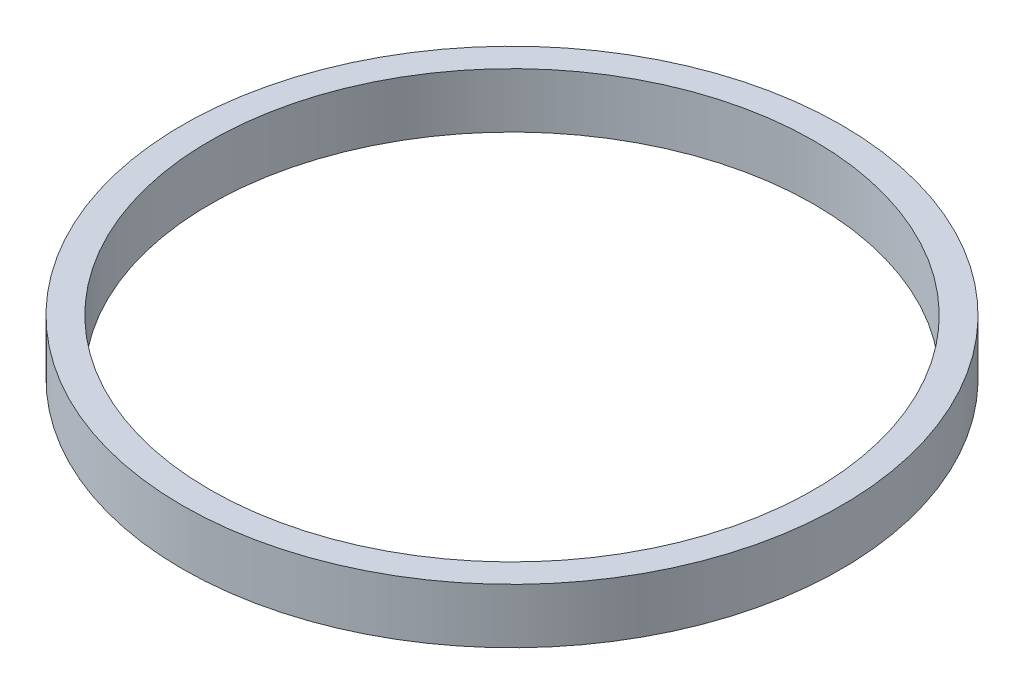
ISO-10303-21;
HEADER;
FILE_DESCRIPTION(('STEP AP214'),'2;1');
FILE_NAME('part.step','',(''),(''),'','','');
FILE_SCHEMA(('AUTOMOTIVE_DESIGN { 1 0 10303 214 1 1 1 1 }'));
ENDSEC;
DATA;
#1=APPLICATION_CONTEXT('core data for automotive mechanical design processes');
#2=APPLICATION_PROTOCOL_DEFINITION('international standard','automotive_design',2000,#1);
#3=PRODUCT_CONTEXT('',#1,'mechanical');
#4=PRODUCT('Part','Part','',(#3));
#5=PRODUCT_RELATED_PRODUCT_CATEGORY('part','',(#4));
#6=PRODUCT_DEFINITION_FORMATION('','',#4);
#7=PRODUCT_DEFINITION_CONTEXT('part definition',#1,'design');
#8=PRODUCT_DEFINITION('design','',#6,#7);
#9=PRODUCT_DEFINITION_SHAPE('','',#8);
#10=(LENGTH_UNIT() NAMED_UNIT(*) SI_UNIT(.MILLI.,.METRE.));
#11=(NAMED_UNIT(*) PLANE_ANGLE_UNIT() SI_UNIT($,.RADIAN.));
#12=(NAMED_UNIT(*) SI_UNIT($,.STERADIAN.) SOLID_ANGLE_UNIT());
#13=UNCERTAINTY_MEASURE_WITH_UNIT(LENGTH_MEASURE(1.E-05),#10,'distance_accuracy_value','');
#14=(GEOMETRIC_REPRESENTATION_CONTEXT(3) GLOBAL_UNCERTAINTY_ASSIGNED_CONTEXT((#13)) GLOBAL_UNIT_ASSIGNED_CONTEXT((#10,
#11,#12)) REPRESENTATION_CONTEXT('',''));
#15=CARTESIAN_POINT('',(0.,0.,0.));
#16=DIRECTION('',(0.,0.,1.));
#17=DIRECTION('',(1.,0.,0.));
#18=AXIS2_PLACEMENT_3D('',#15,#16,#17);
#19=CARTESIAN_POINT('',(0.,2.,0.));
#20=DIRECTION('',(0.,1.,0.));
#21=DIRECTION('',(0.,0.,1.));
#22=AXIS2_PLACEMENT_3D('',#19,#20,#21);
#23=PLANE('',#22);
#24=CARTESIAN_POINT('',(0.,2.,0.));
#25=DIRECTION('',(0.,1.,0.));
#26=DIRECTION('',(0.,0.,1.));
#27=AXIS2_PLACEMENT_3D('',#24,#25,#26);
#28=CIRCLE('',#27,12.);
#29=CARTESIAN_POINT('',(0.,2.,12.));
#30=VERTEX_POINT('',#29);
#31=EDGE_CURVE('E10',#30,#30,#28,.T.);
#32=ORIENTED_EDGE('',*,*,#31,.T.);
#33=EDGE_LOOP('',(#32));
#34=FACE_BOUND('',#33,.T.);
#35=CARTESIAN_POINT('',(0.,2.,0.));
#36=DIRECTION('',(0.,1.,0.));
#37=DIRECTION('',(0.,0.,1.));
#38=AXIS2_PLACEMENT_3D('',#35,#36,#37);
#39=CIRCLE('',#38,11.);
#40=CARTESIAN_POINT('',(0.,2.,11.));
#41=VERTEX_POINT('',#40);
#42=EDGE_CURVE('E54',#41,#41,#39,.T.);
#43=ORIENTED_EDGE('',*,*,#42,.F.);
#44=EDGE_LOOP('',(#43));
#45=FACE_BOUND('',#44,.T.);
#46=ADVANCED_FACE('F41',(#34,#45),#23,.T.);
#47=CARTESIAN_POINT('',(0.,0.,0.));
#48=DIRECTION('',(0.,1.,0.));
#49=DIRECTION('',(0.,0.,1.));
#50=AXIS2_PLACEMENT_3D('',#47,#48,#49);
#51=PLANE('',#50);
#52=CARTESIAN_POINT('',(0.,0.,0.));
#53=DIRECTION('',(0.,1.,0.));
#54=DIRECTION('',(0.,0.,1.));
#55=AXIS2_PLACEMENT_3D('',#52,#53,#54);
#56=CIRCLE('',#55,12.);
#57=CARTESIAN_POINT('',(0.,0.,12.));
#58=VERTEX_POINT('',#57);
#59=EDGE_CURVE('E45',#58,#58,#56,.T.);
#60=ORIENTED_EDGE('',*,*,#59,.F.);
#61=EDGE_LOOP('',(#60));
#62=FACE_BOUND('',#61,.T.);
#63=CARTESIAN_POINT('',(0.,0.,0.));
#64=DIRECTION('',(0.,1.,0.));
#65=DIRECTION('',(0.,0.,1.));
#66=AXIS2_PLACEMENT_3D('',#63,#64,#65);
#67=CIRCLE('',#66,11.);
#68=CARTESIAN_POINT('',(0.,0.,11.));
#69=VERTEX_POINT('',#68);
#70=EDGE_CURVE('E56',#69,#69,#67,.T.);
#71=ORIENTED_EDGE('',*,*,#70,.T.);
#72=EDGE_LOOP('',(#71));
#73=FACE_BOUND('',#72,.T.);
#74=ADVANCED_FACE('F68',(#62,#73),#51,.F.);
#75=CARTESIAN_POINT('',(0.,2.,0.));
#76=DIRECTION('',(0.,-1.,0.));
#77=DIRECTION('',(0.,0.,-1.));
#78=AXIS2_PLACEMENT_3D('',#75,#76,#77);
#79=CYLINDRICAL_SURFACE('',#78,12.);
#80=ORIENTED_EDGE('',*,*,#31,.F.);
#81=EDGE_LOOP('',(#80));
#82=FACE_BOUND('',#81,.T.);
#83=ORIENTED_EDGE('',*,*,#59,.T.);
#84=EDGE_LOOP('',(#83));
#85=FACE_BOUND('',#84,.T.);
#86=ADVANCED_FACE('F43',(#82,#85),#79,.T.);
#87=CARTESIAN_POINT('',(0.,2.,0.));
#88=DIRECTION('',(0.,-1.,0.));
#89=DIRECTION('',(0.,0.,-1.));
#90=AXIS2_PLACEMENT_3D('',#87,#88,#89);
#91=CYLINDRICAL_SURFACE('',#90,11.);
#92=ORIENTED_EDGE('',*,*,#42,.T.);
#93=EDGE_LOOP('',(#92));
#94=FACE_BOUND('',#93,.T.);
#95=ORIENTED_EDGE('',*,*,#70,.F.);
#96=EDGE_LOOP('',(#95));
#97=FACE_BOUND('',#96,.T.);
#98=ADVANCED_FACE('F64',(#94,#97),#91,.F.);
#99=CLOSED_SHELL('',(#46,#74,#86,#98));
#100=MANIFOLD_SOLID_BREP('B2',#99);
#101=ADVANCED_BREP_SHAPE_REPRESENTATION('',(#18,#100),#14);
#102=SHAPE_DEFINITION_REPRESENTATION(#9,#101);
ENDSEC;
END-ISO-10303-21;
